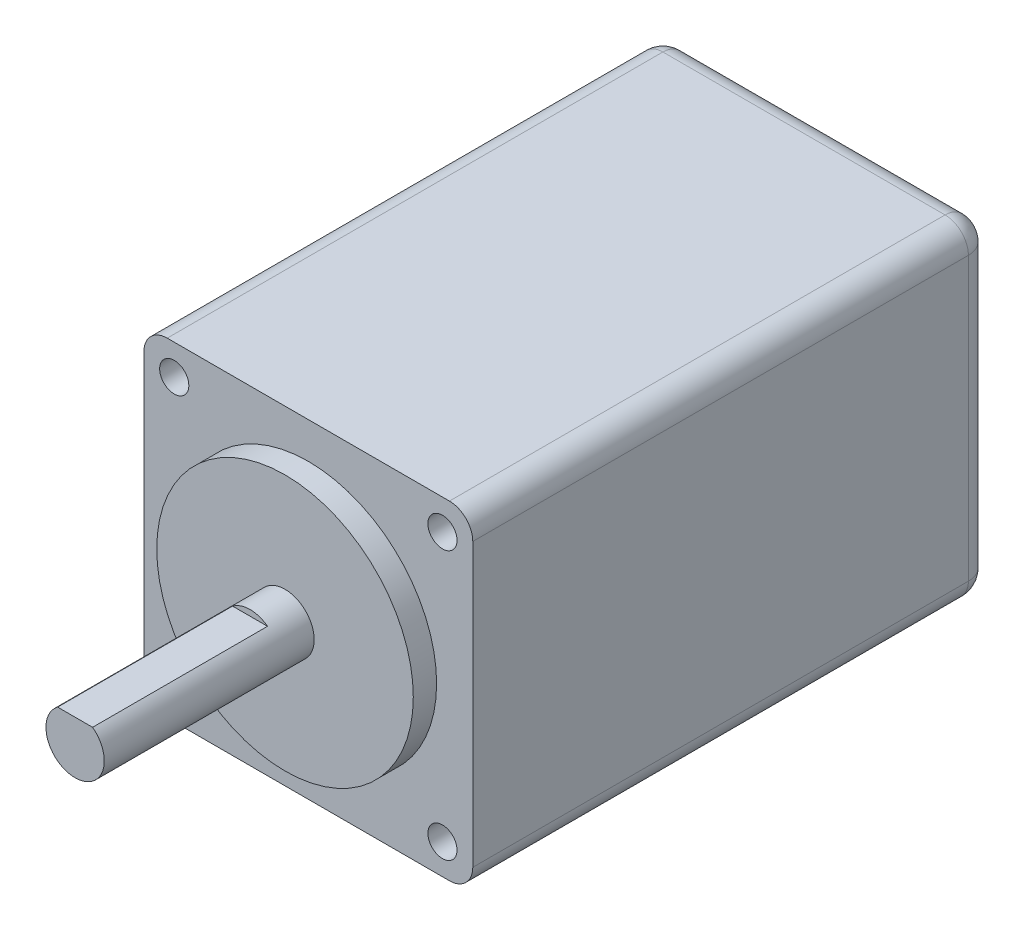
ISO-10303-21;
HEADER;
FILE_DESCRIPTION(('STEP AP214'),'2;1');
FILE_NAME('part.step','',(''),(''),'','','');
FILE_SCHEMA(('AUTOMOTIVE_DESIGN { 1 0 10303 214 1 1 1 1 }'));
ENDSEC;
DATA;
#1=APPLICATION_CONTEXT('core data for automotive mechanical design processes');
#2=APPLICATION_PROTOCOL_DEFINITION('international standard','automotive_design',2000,#1);
#3=PRODUCT_CONTEXT('',#1,'mechanical');
#4=PRODUCT('Part','Part','',(#3));
#5=PRODUCT_RELATED_PRODUCT_CATEGORY('part','',(#4));
#6=PRODUCT_DEFINITION_FORMATION('','',#4);
#7=PRODUCT_DEFINITION_CONTEXT('part definition',#1,'design');
#8=PRODUCT_DEFINITION('design','',#6,#7);
#9=PRODUCT_DEFINITION_SHAPE('','',#8);
#10=(LENGTH_UNIT() NAMED_UNIT(*) SI_UNIT(.MILLI.,.METRE.));
#11=(NAMED_UNIT(*) PLANE_ANGLE_UNIT() SI_UNIT($,.RADIAN.));
#12=(NAMED_UNIT(*) SI_UNIT($,.STERADIAN.) SOLID_ANGLE_UNIT());
#13=UNCERTAINTY_MEASURE_WITH_UNIT(LENGTH_MEASURE(1.E-05),#10,'distance_accuracy_value','');
#14=(GEOMETRIC_REPRESENTATION_CONTEXT(3) GLOBAL_UNCERTAINTY_ASSIGNED_CONTEXT((#13)) GLOBAL_UNIT_ASSIGNED_CONTEXT((#10,
#11,#12)) REPRESENTATION_CONTEXT('',''));
#15=CARTESIAN_POINT('',(0.,0.,0.));
#16=DIRECTION('',(0.,0.,1.));
#17=DIRECTION('',(1.,0.,0.));
#18=AXIS2_PLACEMENT_3D('',#15,#16,#17);
#19=CARTESIAN_POINT('',(0.,0.,46.5));
#20=DIRECTION('',(0.,0.,1.));
#21=DIRECTION('',(1.,0.,0.));
#22=AXIS2_PLACEMENT_3D('',#19,#20,#21);
#23=PLANE('',#22);
#24=CARTESIAN_POINT('',(0.,0.,46.5));
#25=DIRECTION('',(0.,0.,1.));
#26=DIRECTION('',(1.,0.,0.));
#27=AXIS2_PLACEMENT_3D('',#24,#25,#26);
#28=CIRCLE('',#27,11.);
#29=CARTESIAN_POINT('',(11.,0.,46.5));
#30=VERTEX_POINT('',#29);
#31=EDGE_CURVE('E144',#30,#30,#28,.T.);
#32=ORIENTED_EDGE('',*,*,#31,.T.);
#33=EDGE_LOOP('',(#32));
#34=FACE_BOUND('',#33,.T.);
#35=CARTESIAN_POINT('',(0.,0.,46.5));
#36=DIRECTION('',(0.,0.,1.));
#37=DIRECTION('',(1.,0.,0.));
#38=AXIS2_PLACEMENT_3D('',#35,#36,#37);
#39=CIRCLE('',#38,2.5);
#40=CARTESIAN_POINT('',(2.5,0.,46.5));
#41=VERTEX_POINT('',#40);
#42=EDGE_CURVE('E145',#41,#41,#39,.T.);
#43=ORIENTED_EDGE('',*,*,#42,.F.);
#44=EDGE_LOOP('',(#43));
#45=FACE_BOUND('',#44,.T.);
#46=ADVANCED_FACE('F33',(#34,#45),#23,.T.);
#47=CARTESIAN_POINT('',(14.1,14.1,44.5));
#48=DIRECTION('',(0.,0.,-1.));
#49=DIRECTION('',(-1.,0.,0.));
#50=AXIS2_PLACEMENT_3D('',#47,#48,#49);
#51=PLANE('',#50);
#52=CARTESIAN_POINT('',(-11.4999999999997,-11.5,44.5));
#53=DIRECTION('',(0.,0.,1.));
#54=DIRECTION('',(1.,0.,0.));
#55=AXIS2_PLACEMENT_3D('',#52,#53,#54);
#56=CIRCLE('',#55,1.25000000000024);
#57=CARTESIAN_POINT('',(-10.2499999999994,-11.5,44.5));
#58=VERTEX_POINT('',#57);
#59=EDGE_CURVE('E237',#58,#58,#56,.T.);
#60=ORIENTED_EDGE('',*,*,#59,.F.);
#61=EDGE_LOOP('',(#60));
#62=FACE_BOUND('',#61,.T.);
#63=CARTESIAN_POINT('',(11.5000000000003,-11.4999999999997,44.5));
#64=DIRECTION('',(0.,0.,1.));
#65=DIRECTION('',(1.,0.,0.));
#66=AXIS2_PLACEMENT_3D('',#63,#64,#65);
#67=CIRCLE('',#66,1.25000000000049);
#68=CARTESIAN_POINT('',(12.7500000000008,-11.4999999999997,44.5));
#69=VERTEX_POINT('',#68);
#70=EDGE_CURVE('E245',#69,#69,#67,.T.);
#71=ORIENTED_EDGE('',*,*,#70,.F.);
#72=EDGE_LOOP('',(#71));
#73=FACE_BOUND('',#72,.T.);
#74=CARTESIAN_POINT('',(11.5,11.5000000000003,44.5));
#75=DIRECTION('',(0.,0.,1.));
#76=DIRECTION('',(1.,0.,0.));
#77=AXIS2_PLACEMENT_3D('',#74,#75,#76);
#78=CIRCLE('',#77,1.25000000000035);
#79=CARTESIAN_POINT('',(12.7500000000003,11.5000000000003,44.5));
#80=VERTEX_POINT('',#79);
#81=EDGE_CURVE('E251',#80,#80,#78,.T.);
#82=ORIENTED_EDGE('',*,*,#81,.F.);
#83=EDGE_LOOP('',(#82));
#84=FACE_BOUND('',#83,.T.);
#85=CARTESIAN_POINT('',(-11.5,11.5,44.5));
#86=DIRECTION('',(0.,0.,1.));
#87=DIRECTION('',(1.,0.,0.));
#88=AXIS2_PLACEMENT_3D('',#85,#86,#87);
#89=CIRCLE('',#88,1.25);
#90=CARTESIAN_POINT('',(-10.25,11.5,44.5));
#91=VERTEX_POINT('',#90);
#92=EDGE_CURVE('E257',#91,#91,#89,.T.);
#93=ORIENTED_EDGE('',*,*,#92,.F.);
#94=EDGE_LOOP('',(#93));
#95=FACE_BOUND('',#94,.T.);
#96=DIRECTION('',(0.,-1.,0.));
#97=VECTOR('',#96,1.);
#98=CARTESIAN_POINT('',(-14.1,-14.1,44.5));
#99=LINE('',#98,#97);
#100=CARTESIAN_POINT('',(-14.1,12.1,44.5));
#101=VERTEX_POINT('',#100);
#102=CARTESIAN_POINT('',(-14.1,-12.1,44.5));
#103=VERTEX_POINT('',#102);
#104=EDGE_CURVE('E159',#101,#103,#99,.T.);
#105=ORIENTED_EDGE('',*,*,#104,.T.);
#106=CARTESIAN_POINT('',(-12.1,-12.1,44.5));
#107=DIRECTION('',(0.,0.,-1.));
#108=DIRECTION('',(-1.,0.,0.));
#109=AXIS2_PLACEMENT_3D('',#106,#107,#108);
#110=CIRCLE('',#109,2.);
#111=CARTESIAN_POINT('',(-12.1,-14.1,44.5));
#112=VERTEX_POINT('',#111);
#113=EDGE_CURVE('E11',#103,#112,#110,.F.);
#114=ORIENTED_EDGE('',*,*,#113,.T.);
#115=DIRECTION('',(1.,0.,0.));
#116=VECTOR('',#115,1.);
#117=CARTESIAN_POINT('',(-14.1,-14.1,44.5));
#118=LINE('',#117,#116);
#119=CARTESIAN_POINT('',(12.1,-14.1,44.5));
#120=VERTEX_POINT('',#119);
#121=EDGE_CURVE('E162',#112,#120,#118,.T.);
#122=ORIENTED_EDGE('',*,*,#121,.T.);
#123=CARTESIAN_POINT('',(12.1,-12.1,44.5));
#124=DIRECTION('',(0.,0.,-1.));
#125=DIRECTION('',(-1.,0.,0.));
#126=AXIS2_PLACEMENT_3D('',#123,#124,#125);
#127=CIRCLE('',#126,2.);
#128=CARTESIAN_POINT('',(14.1,-12.1,44.5));
#129=VERTEX_POINT('',#128);
#130=EDGE_CURVE('E42',#120,#129,#127,.F.);
#131=ORIENTED_EDGE('',*,*,#130,.T.);
#132=DIRECTION('',(0.,1.,0.));
#133=VECTOR('',#132,1.);
#134=CARTESIAN_POINT('',(14.1,-14.1,44.5));
#135=LINE('',#134,#133);
#136=CARTESIAN_POINT('',(14.1,12.1,44.5));
#137=VERTEX_POINT('',#136);
#138=EDGE_CURVE('E148',#129,#137,#135,.T.);
#139=ORIENTED_EDGE('',*,*,#138,.T.);
#140=CARTESIAN_POINT('',(12.1,12.1,44.5));
#141=DIRECTION('',(0.,0.,-1.));
#142=DIRECTION('',(-1.,0.,0.));
#143=AXIS2_PLACEMENT_3D('',#140,#141,#142);
#144=CIRCLE('',#143,2.);
#145=CARTESIAN_POINT('',(12.1,14.1,44.5));
#146=VERTEX_POINT('',#145);
#147=EDGE_CURVE('E200',#137,#146,#144,.F.);
#148=ORIENTED_EDGE('',*,*,#147,.T.);
#149=DIRECTION('',(-1.,0.,0.));
#150=VECTOR('',#149,1.);
#151=CARTESIAN_POINT('',(-14.1,14.1,44.5));
#152=LINE('',#151,#150);
#153=CARTESIAN_POINT('',(-12.1,14.1,44.5));
#154=VERTEX_POINT('',#153);
#155=EDGE_CURVE('E156',#146,#154,#152,.T.);
#156=ORIENTED_EDGE('',*,*,#155,.T.);
#157=CARTESIAN_POINT('',(-12.1,12.1,44.5));
#158=DIRECTION('',(0.,0.,-1.));
#159=DIRECTION('',(-1.,0.,0.));
#160=AXIS2_PLACEMENT_3D('',#157,#158,#159);
#161=CIRCLE('',#160,2.);
#162=EDGE_CURVE('E202',#154,#101,#161,.F.);
#163=ORIENTED_EDGE('',*,*,#162,.T.);
#164=EDGE_LOOP('',(#105,#114,#122,#131,#139,#148,#156,#163));
#165=FACE_BOUND('',#164,.T.);
#166=CARTESIAN_POINT('',(0.,0.,44.5));
#167=DIRECTION('',(0.,0.,-1.));
#168=DIRECTION('',(-1.,0.,0.));
#169=AXIS2_PLACEMENT_3D('',#166,#167,#168);
#170=CIRCLE('',#169,11.);
#171=CARTESIAN_POINT('',(-11.,0.,44.5));
#172=VERTEX_POINT('',#171);
#173=EDGE_CURVE('E134',#172,#172,#170,.F.);
#174=ORIENTED_EDGE('',*,*,#173,.F.);
#175=EDGE_LOOP('',(#174));
#176=FACE_BOUND('',#175,.T.);
#177=ADVANCED_FACE('F278',(#62,#73,#84,#95,#165,#176),#51,.F.);
#178=CARTESIAN_POINT('',(14.1,-14.1,44.5));
#179=DIRECTION('',(-1.,0.,0.));
#180=DIRECTION('',(0.,0.,1.));
#181=AXIS2_PLACEMENT_3D('',#178,#179,#180);
#182=PLANE('',#181);
#183=ORIENTED_EDGE('',*,*,#138,.F.);
#184=DIRECTION('',(0.,0.,-1.));
#185=VECTOR('',#184,1.);
#186=CARTESIAN_POINT('',(14.1,-12.1,44.5));
#187=LINE('',#186,#185);
#188=CARTESIAN_POINT('',(14.1,-12.1,2.));
#189=VERTEX_POINT('',#188);
#190=EDGE_CURVE('E50',#129,#189,#187,.T.);
#191=ORIENTED_EDGE('',*,*,#190,.T.);
#192=DIRECTION('',(0.,1.,0.));
#193=VECTOR('',#192,1.);
#194=CARTESIAN_POINT('',(14.1,14.1,2.));
#195=LINE('',#194,#193);
#196=CARTESIAN_POINT('',(14.1,12.1,2.));
#197=VERTEX_POINT('',#196);
#198=EDGE_CURVE('E55',#189,#197,#195,.T.);
#199=ORIENTED_EDGE('',*,*,#198,.T.);
#200=DIRECTION('',(0.,0.,-1.));
#201=VECTOR('',#200,1.);
#202=CARTESIAN_POINT('',(14.1,12.1,44.5));
#203=LINE('',#202,#201);
#204=EDGE_CURVE('E196',#197,#137,#203,.F.);
#205=ORIENTED_EDGE('',*,*,#204,.T.);
#206=EDGE_LOOP('',(#183,#191,#199,#205));
#207=FACE_BOUND('',#206,.T.);
#208=ADVANCED_FACE('F284',(#207),#182,.F.);
#209=CARTESIAN_POINT('',(-14.1,14.1,44.5));
#210=DIRECTION('',(0.,-1.,0.));
#211=DIRECTION('',(0.,0.,-1.));
#212=AXIS2_PLACEMENT_3D('',#209,#210,#211);
#213=PLANE('',#212);
#214=DIRECTION('',(-1.,0.,0.));
#215=VECTOR('',#214,1.);
#216=CARTESIAN_POINT('',(-14.1,14.1,2.));
#217=LINE('',#216,#215);
#218=CARTESIAN_POINT('',(12.1,14.1,2.));
#219=VERTEX_POINT('',#218);
#220=CARTESIAN_POINT('',(-12.1,14.1,2.));
#221=VERTEX_POINT('',#220);
#222=EDGE_CURVE('E170',#219,#221,#217,.T.);
#223=ORIENTED_EDGE('',*,*,#222,.T.);
#224=DIRECTION('',(0.,0.,-1.));
#225=VECTOR('',#224,1.);
#226=CARTESIAN_POINT('',(-12.1,14.1,44.5));
#227=LINE('',#226,#225);
#228=EDGE_CURVE('E173',#221,#154,#227,.F.);
#229=ORIENTED_EDGE('',*,*,#228,.T.);
#230=ORIENTED_EDGE('',*,*,#155,.F.);
#231=DIRECTION('',(0.,0.,-1.));
#232=VECTOR('',#231,1.);
#233=CARTESIAN_POINT('',(12.1,14.1,44.5));
#234=LINE('',#233,#232);
#235=EDGE_CURVE('E168',#146,#219,#234,.T.);
#236=ORIENTED_EDGE('',*,*,#235,.T.);
#237=EDGE_LOOP('',(#223,#229,#230,#236));
#238=FACE_BOUND('',#237,.T.);
#239=ADVANCED_FACE('F305',(#238),#213,.F.);
#240=CARTESIAN_POINT('',(-14.1,-14.1,44.5));
#241=DIRECTION('',(1.,0.,0.));
#242=DIRECTION('',(0.,0.,-1.));
#243=AXIS2_PLACEMENT_3D('',#240,#241,#242);
#244=PLANE('',#243);
#245=DIRECTION('',(0.,-1.,0.));
#246=VECTOR('',#245,1.);
#247=CARTESIAN_POINT('',(-14.1,-14.1,2.));
#248=LINE('',#247,#246);
#249=CARTESIAN_POINT('',(-14.1,12.1,2.));
#250=VERTEX_POINT('',#249);
#251=CARTESIAN_POINT('',(-14.1,-12.1,2.));
#252=VERTEX_POINT('',#251);
#253=EDGE_CURVE('E186',#250,#252,#248,.T.);
#254=ORIENTED_EDGE('',*,*,#253,.T.);
#255=DIRECTION('',(0.,0.,-1.));
#256=VECTOR('',#255,1.);
#257=CARTESIAN_POINT('',(-14.1,-12.1,44.5));
#258=LINE('',#257,#256);
#259=EDGE_CURVE('E188',#252,#103,#258,.F.);
#260=ORIENTED_EDGE('',*,*,#259,.T.);
#261=ORIENTED_EDGE('',*,*,#104,.F.);
#262=DIRECTION('',(0.,0.,-1.));
#263=VECTOR('',#262,1.);
#264=CARTESIAN_POINT('',(-14.1,12.1,44.5));
#265=LINE('',#264,#263);
#266=EDGE_CURVE('E184',#101,#250,#265,.T.);
#267=ORIENTED_EDGE('',*,*,#266,.T.);
#268=EDGE_LOOP('',(#254,#260,#261,#267));
#269=FACE_BOUND('',#268,.T.);
#270=ADVANCED_FACE('F301',(#269),#244,.F.);
#271=CARTESIAN_POINT('',(-14.1,-14.1,44.5));
#272=DIRECTION('',(0.,1.,0.));
#273=DIRECTION('',(0.,0.,1.));
#274=AXIS2_PLACEMENT_3D('',#271,#272,#273);
#275=PLANE('',#274);
#276=ORIENTED_EDGE('',*,*,#121,.F.);
#277=DIRECTION('',(0.,0.,-1.));
#278=VECTOR('',#277,1.);
#279=CARTESIAN_POINT('',(-12.1,-14.1,44.5));
#280=LINE('',#279,#278);
#281=CARTESIAN_POINT('',(-12.1,-14.1,2.));
#282=VERTEX_POINT('',#281);
#283=EDGE_CURVE('E194',#112,#282,#280,.T.);
#284=ORIENTED_EDGE('',*,*,#283,.T.);
#285=DIRECTION('',(1.,0.,0.));
#286=VECTOR('',#285,1.);
#287=CARTESIAN_POINT('',(14.1,-14.1,2.));
#288=LINE('',#287,#286);
#289=CARTESIAN_POINT('',(12.1,-14.1,2.));
#290=VERTEX_POINT('',#289);
#291=EDGE_CURVE('E192',#282,#290,#288,.T.);
#292=ORIENTED_EDGE('',*,*,#291,.T.);
#293=DIRECTION('',(0.,0.,-1.));
#294=VECTOR('',#293,1.);
#295=CARTESIAN_POINT('',(12.1,-14.1,44.5));
#296=LINE('',#295,#294);
#297=EDGE_CURVE('E190',#290,#120,#296,.F.);
#298=ORIENTED_EDGE('',*,*,#297,.T.);
#299=EDGE_LOOP('',(#276,#284,#292,#298));
#300=FACE_BOUND('',#299,.T.);
#301=ADVANCED_FACE('F297',(#300),#275,.F.);
#302=CARTESIAN_POINT('',(14.1,14.1,0.));
#303=DIRECTION('',(0.,0.,-1.));
#304=DIRECTION('',(-1.,0.,0.));
#305=AXIS2_PLACEMENT_3D('',#302,#303,#304);
#306=PLANE('',#305);
#307=DIRECTION('',(0.,-1.,0.));
#308=VECTOR('',#307,1.);
#309=CARTESIAN_POINT('',(-12.1,14.1,0.));
#310=LINE('',#309,#308);
#311=CARTESIAN_POINT('',(-12.1,-12.1,0.));
#312=VERTEX_POINT('',#311);
#313=CARTESIAN_POINT('',(-12.1,12.1,0.));
#314=VERTEX_POINT('',#313);
#315=EDGE_CURVE('E179',#312,#314,#310,.F.);
#316=ORIENTED_EDGE('',*,*,#315,.T.);
#317=DIRECTION('',(-1.,0.,0.));
#318=VECTOR('',#317,1.);
#319=CARTESIAN_POINT('',(14.1,12.1,0.));
#320=LINE('',#319,#318);
#321=CARTESIAN_POINT('',(12.1,12.1,0.));
#322=VERTEX_POINT('',#321);
#323=EDGE_CURVE('E181',#314,#322,#320,.F.);
#324=ORIENTED_EDGE('',*,*,#323,.T.);
#325=DIRECTION('',(0.,1.,0.));
#326=VECTOR('',#325,1.);
#327=CARTESIAN_POINT('',(12.1,-14.1,0.));
#328=LINE('',#327,#326);
#329=CARTESIAN_POINT('',(12.1,-12.1,0.));
#330=VERTEX_POINT('',#329);
#331=EDGE_CURVE('E175',#322,#330,#328,.F.);
#332=ORIENTED_EDGE('',*,*,#331,.T.);
#333=DIRECTION('',(1.,0.,0.));
#334=VECTOR('',#333,1.);
#335=CARTESIAN_POINT('',(-14.1,-12.1,0.));
#336=LINE('',#335,#334);
#337=EDGE_CURVE('E177',#330,#312,#336,.F.);
#338=ORIENTED_EDGE('',*,*,#337,.T.);
#339=EDGE_LOOP('',(#316,#324,#332,#338));
#340=FACE_BOUND('',#339,.T.);
#341=ADVANCED_FACE('F292',(#340),#306,.T.);
#342=CARTESIAN_POINT('',(0.,0.,46.5));
#343=DIRECTION('',(0.,0.,-1.));
#344=DIRECTION('',(-1.,0.,0.));
#345=AXIS2_PLACEMENT_3D('',#342,#343,#344);
#346=CYLINDRICAL_SURFACE('',#345,11.);
#347=ORIENTED_EDGE('',*,*,#31,.F.);
#348=EDGE_LOOP('',(#347));
#349=FACE_BOUND('',#348,.T.);
#350=ORIENTED_EDGE('',*,*,#173,.T.);
#351=EDGE_LOOP('',(#350));
#352=FACE_BOUND('',#351,.T.);
#353=ADVANCED_FACE('F290',(#349,#352),#346,.T.);
#354=CARTESIAN_POINT('',(0.,0.,64.5));
#355=DIRECTION('',(0.,0.,-1.));
#356=DIRECTION('',(-1.,0.,0.));
#357=AXIS2_PLACEMENT_3D('',#354,#355,#356);
#358=CYLINDRICAL_SURFACE('',#357,2.5);
#359=CARTESIAN_POINT('',(0.,0.,64.5));
#360=DIRECTION('',(0.,0.,1.));
#361=DIRECTION('',(1.,0.,0.));
#362=AXIS2_PLACEMENT_3D('',#359,#360,#361);
#363=CIRCLE('',#362,2.5);
#364=CARTESIAN_POINT('',(-1.5,2.,64.5));
#365=VERTEX_POINT('',#364);
#366=CARTESIAN_POINT('',(1.5,2.,64.5));
#367=VERTEX_POINT('',#366);
#368=EDGE_CURVE('E140',#365,#367,#363,.T.);
#369=ORIENTED_EDGE('',*,*,#368,.F.);
#370=DIRECTION('',(0.,0.,-1.));
#371=VECTOR('',#370,1.);
#372=CARTESIAN_POINT('',(-1.5,2.,64.5));
#373=LINE('',#372,#371);
#374=CARTESIAN_POINT('',(-1.5,2.,49.5));
#375=VERTEX_POINT('',#374);
#376=EDGE_CURVE('E129',#365,#375,#373,.T.);
#377=ORIENTED_EDGE('',*,*,#376,.T.);
#378=CARTESIAN_POINT('',(0.,0.,49.5));
#379=DIRECTION('',(0.,0.,-1.));
#380=DIRECTION('',(-1.,0.,0.));
#381=AXIS2_PLACEMENT_3D('',#378,#379,#380);
#382=CIRCLE('',#381,2.5);
#383=CARTESIAN_POINT('',(1.5,2.,49.5));
#384=VERTEX_POINT('',#383);
#385=EDGE_CURVE('E133',#375,#384,#382,.T.);
#386=ORIENTED_EDGE('',*,*,#385,.T.);
#387=DIRECTION('',(0.,0.,-1.));
#388=VECTOR('',#387,1.);
#389=CARTESIAN_POINT('',(1.5,2.,64.5));
#390=LINE('',#389,#388);
#391=EDGE_CURVE('E126',#384,#367,#390,.F.);
#392=ORIENTED_EDGE('',*,*,#391,.T.);
#393=EDGE_LOOP('',(#369,#377,#386,#392));
#394=FACE_BOUND('',#393,.T.);
#395=ORIENTED_EDGE('',*,*,#42,.T.);
#396=EDGE_LOOP('',(#395));
#397=FACE_BOUND('',#396,.T.);
#398=ADVANCED_FACE('F138',(#394,#397),#358,.T.);
#399=CARTESIAN_POINT('',(0.,0.,64.5));
#400=DIRECTION('',(0.,0.,1.));
#401=DIRECTION('',(1.,0.,0.));
#402=AXIS2_PLACEMENT_3D('',#399,#400,#401);
#403=PLANE('',#402);
#404=DIRECTION('',(1.,0.,0.));
#405=VECTOR('',#404,1.);
#406=CARTESIAN_POINT('',(0.,2.,64.5));
#407=LINE('',#406,#405);
#408=EDGE_CURVE('E122',#365,#367,#407,.T.);
#409=ORIENTED_EDGE('',*,*,#408,.F.);
#410=ORIENTED_EDGE('',*,*,#368,.T.);
#411=EDGE_LOOP('',(#409,#410));
#412=FACE_BOUND('',#411,.T.);
#413=ADVANCED_FACE('F143',(#412),#403,.T.);
#414=CARTESIAN_POINT('',(-5.,2.5,49.5));
#415=DIRECTION('',(0.,0.,-1.));
#416=DIRECTION('',(-1.,0.,0.));
#417=AXIS2_PLACEMENT_3D('',#414,#415,#416);
#418=PLANE('',#417);
#419=DIRECTION('',(1.,0.,0.));
#420=VECTOR('',#419,1.);
#421=CARTESIAN_POINT('',(-5.,2.,49.5));
#422=LINE('',#421,#420);
#423=EDGE_CURVE('E141',#375,#384,#422,.T.);
#424=ORIENTED_EDGE('',*,*,#423,.T.);
#425=ORIENTED_EDGE('',*,*,#385,.F.);
#426=EDGE_LOOP('',(#424,#425));
#427=FACE_BOUND('',#426,.T.);
#428=ADVANCED_FACE('F266',(#427),#418,.F.);
#429=CARTESIAN_POINT('',(-5.,2.,64.5));
#430=DIRECTION('',(0.,-1.,0.));
#431=DIRECTION('',(0.,0.,-1.));
#432=AXIS2_PLACEMENT_3D('',#429,#430,#431);
#433=PLANE('',#432);
#434=ORIENTED_EDGE('',*,*,#408,.T.);
#435=ORIENTED_EDGE('',*,*,#391,.F.);
#436=ORIENTED_EDGE('',*,*,#423,.F.);
#437=ORIENTED_EDGE('',*,*,#376,.F.);
#438=EDGE_LOOP('',(#434,#435,#436,#437));
#439=FACE_BOUND('',#438,.T.);
#440=ADVANCED_FACE('F124',(#439),#433,.F.);
#441=CARTESIAN_POINT('',(-11.5,11.5,42.));
#442=DIRECTION('',(0.,0.,1.));
#443=DIRECTION('',(1.,0.,0.));
#444=AXIS2_PLACEMENT_3D('',#441,#442,#443);
#445=CYLINDRICAL_SURFACE('',#444,1.25);
#446=CARTESIAN_POINT('',(-11.5,11.5,42.));
#447=DIRECTION('',(0.,0.,1.));
#448=DIRECTION('',(1.,0.,0.));
#449=AXIS2_PLACEMENT_3D('',#446,#447,#448);
#450=CIRCLE('',#449,1.25);
#451=CARTESIAN_POINT('',(-10.25,11.5,42.));
#452=VERTEX_POINT('',#451);
#453=EDGE_CURVE('E260',#452,#452,#450,.T.);
#454=ORIENTED_EDGE('',*,*,#453,.F.);
#455=EDGE_LOOP('',(#454));
#456=FACE_BOUND('',#455,.T.);
#457=ORIENTED_EDGE('',*,*,#92,.T.);
#458=EDGE_LOOP('',(#457));
#459=FACE_BOUND('',#458,.T.);
#460=ADVANCED_FACE('F273',(#456,#459),#445,.F.);
#461=CARTESIAN_POINT('',(-11.5,11.5,42.));
#462=DIRECTION('',(0.,0.,1.));
#463=DIRECTION('',(1.,0.,0.));
#464=AXIS2_PLACEMENT_3D('',#461,#462,#463);
#465=PLANE('',#464);
#466=ORIENTED_EDGE('',*,*,#453,.T.);
#467=EDGE_LOOP('',(#466));
#468=FACE_BOUND('',#467,.T.);
#469=ADVANCED_FACE('F418',(#468),#465,.T.);
#470=CARTESIAN_POINT('',(11.5,11.5000000000003,42.));
#471=DIRECTION('',(0.,0.,1.));
#472=DIRECTION('',(1.,0.,0.));
#473=AXIS2_PLACEMENT_3D('',#470,#471,#472);
#474=CYLINDRICAL_SURFACE('',#473,1.25000000000035);
#475=CARTESIAN_POINT('',(11.5,11.5000000000003,42.));
#476=DIRECTION('',(0.,0.,1.));
#477=DIRECTION('',(1.,0.,0.));
#478=AXIS2_PLACEMENT_3D('',#475,#476,#477);
#479=CIRCLE('',#478,1.25000000000035);
#480=CARTESIAN_POINT('',(12.7500000000003,11.5000000000003,42.));
#481=VERTEX_POINT('',#480);
#482=EDGE_CURVE('E254',#481,#481,#479,.T.);
#483=ORIENTED_EDGE('',*,*,#482,.F.);
#484=EDGE_LOOP('',(#483));
#485=FACE_BOUND('',#484,.T.);
#486=ORIENTED_EDGE('',*,*,#81,.T.);
#487=EDGE_LOOP('',(#486));
#488=FACE_BOUND('',#487,.T.);
#489=ADVANCED_FACE('F414',(#485,#488),#474,.F.);
#490=CARTESIAN_POINT('',(11.5,11.5000000000003,42.));
#491=DIRECTION('',(0.,0.,1.));
#492=DIRECTION('',(1.,0.,0.));
#493=AXIS2_PLACEMENT_3D('',#490,#491,#492);
#494=PLANE('',#493);
#495=ORIENTED_EDGE('',*,*,#482,.T.);
#496=EDGE_LOOP('',(#495));
#497=FACE_BOUND('',#496,.T.);
#498=ADVANCED_FACE('F410',(#497),#494,.T.);
#499=CARTESIAN_POINT('',(11.5000000000003,-11.4999999999997,42.));
#500=DIRECTION('',(0.,0.,1.));
#501=DIRECTION('',(1.,0.,0.));
#502=AXIS2_PLACEMENT_3D('',#499,#500,#501);
#503=CYLINDRICAL_SURFACE('',#502,1.25000000000049);
#504=CARTESIAN_POINT('',(11.5000000000003,-11.4999999999997,42.));
#505=DIRECTION('',(0.,0.,1.));
#506=DIRECTION('',(1.,0.,0.));
#507=AXIS2_PLACEMENT_3D('',#504,#505,#506);
#508=CIRCLE('',#507,1.25000000000049);
#509=CARTESIAN_POINT('',(12.7500000000008,-11.4999999999997,42.));
#510=VERTEX_POINT('',#509);
#511=EDGE_CURVE('E248',#510,#510,#508,.T.);
#512=ORIENTED_EDGE('',*,*,#511,.F.);
#513=EDGE_LOOP('',(#512));
#514=FACE_BOUND('',#513,.T.);
#515=ORIENTED_EDGE('',*,*,#70,.T.);
#516=EDGE_LOOP('',(#515));
#517=FACE_BOUND('',#516,.T.);
#518=ADVANCED_FACE('F406',(#514,#517),#503,.F.);
#519=CARTESIAN_POINT('',(11.5000000000003,-11.4999999999997,42.));
#520=DIRECTION('',(0.,0.,1.));
#521=DIRECTION('',(1.,0.,0.));
#522=AXIS2_PLACEMENT_3D('',#519,#520,#521);
#523=PLANE('',#522);
#524=ORIENTED_EDGE('',*,*,#511,.T.);
#525=EDGE_LOOP('',(#524));
#526=FACE_BOUND('',#525,.T.);
#527=ADVANCED_FACE('F400',(#526),#523,.T.);
#528=CARTESIAN_POINT('',(-11.4999999999997,-11.5,42.));
#529=DIRECTION('',(0.,0.,1.));
#530=DIRECTION('',(1.,0.,0.));
#531=AXIS2_PLACEMENT_3D('',#528,#529,#530);
#532=CYLINDRICAL_SURFACE('',#531,1.25000000000024);
#533=CARTESIAN_POINT('',(-11.4999999999997,-11.5,42.));
#534=DIRECTION('',(0.,0.,1.));
#535=DIRECTION('',(1.,0.,0.));
#536=AXIS2_PLACEMENT_3D('',#533,#534,#535);
#537=CIRCLE('',#536,1.25000000000024);
#538=CARTESIAN_POINT('',(-10.2499999999994,-11.5,42.));
#539=VERTEX_POINT('',#538);
#540=EDGE_CURVE('E240',#539,#539,#537,.T.);
#541=ORIENTED_EDGE('',*,*,#540,.F.);
#542=EDGE_LOOP('',(#541));
#543=FACE_BOUND('',#542,.T.);
#544=ORIENTED_EDGE('',*,*,#59,.T.);
#545=EDGE_LOOP('',(#544));
#546=FACE_BOUND('',#545,.T.);
#547=ADVANCED_FACE('F394',(#543,#546),#532,.F.);
#548=CARTESIAN_POINT('',(-11.4999999999997,-11.5,42.));
#549=DIRECTION('',(0.,0.,1.));
#550=DIRECTION('',(1.,0.,0.));
#551=AXIS2_PLACEMENT_3D('',#548,#549,#550);
#552=PLANE('',#551);
#553=ORIENTED_EDGE('',*,*,#540,.T.);
#554=EDGE_LOOP('',(#553));
#555=FACE_BOUND('',#554,.T.);
#556=ADVANCED_FACE('F356',(#555),#552,.T.);
#557=CARTESIAN_POINT('',(12.1,-12.1,44.5));
#558=DIRECTION('',(0.,0.,-1.));
#559=DIRECTION('',(-1.,0.,0.));
#560=AXIS2_PLACEMENT_3D('',#557,#558,#559);
#561=CYLINDRICAL_SURFACE('',#560,2.);
#562=ORIENTED_EDGE('',*,*,#130,.F.);
#563=ORIENTED_EDGE('',*,*,#297,.F.);
#564=CARTESIAN_POINT('',(12.1,-12.1,2.));
#565=DIRECTION('',(0.,0.,-1.));
#566=DIRECTION('',(-1.,0.,0.));
#567=AXIS2_PLACEMENT_3D('',#564,#565,#566);
#568=CIRCLE('',#567,2.);
#569=EDGE_CURVE('E232',#189,#290,#568,.T.);
#570=ORIENTED_EDGE('',*,*,#569,.F.);
#571=ORIENTED_EDGE('',*,*,#190,.F.);
#572=EDGE_LOOP('',(#562,#563,#570,#571));
#573=FACE_BOUND('',#572,.T.);
#574=ADVANCED_FACE('F35',(#573),#561,.T.);
#575=CARTESIAN_POINT('',(-12.1,-12.1,44.5));
#576=DIRECTION('',(0.,0.,-1.));
#577=DIRECTION('',(-1.,0.,0.));
#578=AXIS2_PLACEMENT_3D('',#575,#576,#577);
#579=CYLINDRICAL_SURFACE('',#578,2.);
#580=ORIENTED_EDGE('',*,*,#113,.F.);
#581=ORIENTED_EDGE('',*,*,#259,.F.);
#582=CARTESIAN_POINT('',(-12.1,-12.1,2.));
#583=DIRECTION('',(0.,0.,-1.));
#584=DIRECTION('',(-1.,0.,0.));
#585=AXIS2_PLACEMENT_3D('',#582,#583,#584);
#586=CIRCLE('',#585,2.);
#587=EDGE_CURVE('E230',#282,#252,#586,.T.);
#588=ORIENTED_EDGE('',*,*,#587,.F.);
#589=ORIENTED_EDGE('',*,*,#283,.F.);
#590=EDGE_LOOP('',(#580,#581,#588,#589));
#591=FACE_BOUND('',#590,.T.);
#592=ADVANCED_FACE('F349',(#591),#579,.T.);
#593=CARTESIAN_POINT('',(-14.1,-12.1,2.));
#594=DIRECTION('',(-1.,0.,0.));
#595=DIRECTION('',(0.,0.,1.));
#596=AXIS2_PLACEMENT_3D('',#593,#594,#595);
#597=CYLINDRICAL_SURFACE('',#596,2.);
#598=CARTESIAN_POINT('',(12.1,-12.1,2.));
#599=DIRECTION('',(1.,0.,0.));
#600=DIRECTION('',(0.,0.,-1.));
#601=AXIS2_PLACEMENT_3D('',#598,#599,#600);
#602=CIRCLE('',#601,2.);
#603=EDGE_CURVE('E37',#290,#330,#602,.T.);
#604=ORIENTED_EDGE('',*,*,#603,.F.);
#605=ORIENTED_EDGE('',*,*,#291,.F.);
#606=CARTESIAN_POINT('',(-12.1,-12.1,2.));
#607=DIRECTION('',(-1.,0.,0.));
#608=DIRECTION('',(0.,0.,1.));
#609=AXIS2_PLACEMENT_3D('',#606,#607,#608);
#610=CIRCLE('',#609,2.);
#611=EDGE_CURVE('E227',#312,#282,#610,.T.);
#612=ORIENTED_EDGE('',*,*,#611,.F.);
#613=ORIENTED_EDGE('',*,*,#337,.F.);
#614=EDGE_LOOP('',(#604,#605,#612,#613));
#615=FACE_BOUND('',#614,.T.);
#616=ADVANCED_FACE('F347',(#615),#597,.T.);
#617=CARTESIAN_POINT('',(12.1,-12.1,2.));
#618=DIRECTION('',(0.,0.,1.));
#619=DIRECTION('',(1.,0.,0.));
#620=AXIS2_PLACEMENT_3D('',#617,#618,#619);
#621=SPHERICAL_SURFACE('',#620,2.);
#622=ORIENTED_EDGE('',*,*,#569,.T.);
#623=ORIENTED_EDGE('',*,*,#603,.T.);
#624=CARTESIAN_POINT('',(12.1,-12.1,2.));
#625=DIRECTION('',(0.,-1.,0.));
#626=DIRECTION('',(0.,0.,-1.));
#627=AXIS2_PLACEMENT_3D('',#624,#625,#626);
#628=CIRCLE('',#627,2.);
#629=EDGE_CURVE('E224',#189,#330,#628,.F.);
#630=ORIENTED_EDGE('',*,*,#629,.F.);
#631=EDGE_LOOP('',(#622,#623,#630));
#632=FACE_BOUND('',#631,.T.);
#633=ADVANCED_FACE('F343',(#632),#621,.T.);
#634=CARTESIAN_POINT('',(-12.1,-12.1,2.));
#635=DIRECTION('',(0.,0.,1.));
#636=DIRECTION('',(1.,0.,0.));
#637=AXIS2_PLACEMENT_3D('',#634,#635,#636);
#638=SPHERICAL_SURFACE('',#637,2.);
#639=ORIENTED_EDGE('',*,*,#611,.T.);
#640=ORIENTED_EDGE('',*,*,#587,.T.);
#641=CARTESIAN_POINT('',(-12.1,-12.1,2.));
#642=DIRECTION('',(0.,-1.,0.));
#643=DIRECTION('',(0.,0.,-1.));
#644=AXIS2_PLACEMENT_3D('',#641,#642,#643);
#645=CIRCLE('',#644,2.);
#646=EDGE_CURVE('E221',#312,#252,#645,.F.);
#647=ORIENTED_EDGE('',*,*,#646,.F.);
#648=EDGE_LOOP('',(#639,#640,#647));
#649=FACE_BOUND('',#648,.T.);
#650=ADVANCED_FACE('F339',(#649),#638,.T.);
#651=CARTESIAN_POINT('',(12.1,-14.1,2.));
#652=DIRECTION('',(0.,-1.,0.));
#653=DIRECTION('',(0.,0.,-1.));
#654=AXIS2_PLACEMENT_3D('',#651,#652,#653);
#655=CYLINDRICAL_SURFACE('',#654,2.);
#656=ORIENTED_EDGE('',*,*,#629,.T.);
#657=ORIENTED_EDGE('',*,*,#331,.F.);
#658=CARTESIAN_POINT('',(12.1,12.1,2.));
#659=DIRECTION('',(0.,1.,0.));
#660=DIRECTION('',(0.,0.,1.));
#661=AXIS2_PLACEMENT_3D('',#658,#659,#660);
#662=CIRCLE('',#661,2.);
#663=EDGE_CURVE('E218',#197,#322,#662,.T.);
#664=ORIENTED_EDGE('',*,*,#663,.F.);
#665=ORIENTED_EDGE('',*,*,#198,.F.);
#666=EDGE_LOOP('',(#656,#657,#664,#665));
#667=FACE_BOUND('',#666,.T.);
#668=ADVANCED_FACE('F335',(#667),#655,.T.);
#669=CARTESIAN_POINT('',(12.1,12.1,44.5));
#670=DIRECTION('',(0.,0.,-1.));
#671=DIRECTION('',(-1.,0.,0.));
#672=AXIS2_PLACEMENT_3D('',#669,#670,#671);
#673=CYLINDRICAL_SURFACE('',#672,2.);
#674=ORIENTED_EDGE('',*,*,#147,.F.);
#675=ORIENTED_EDGE('',*,*,#204,.F.);
#676=CARTESIAN_POINT('',(12.1,12.1,2.));
#677=DIRECTION('',(0.,0.,-1.));
#678=DIRECTION('',(-1.,0.,0.));
#679=AXIS2_PLACEMENT_3D('',#676,#677,#678);
#680=CIRCLE('',#679,2.);
#681=EDGE_CURVE('E215',#219,#197,#680,.T.);
#682=ORIENTED_EDGE('',*,*,#681,.F.);
#683=ORIENTED_EDGE('',*,*,#235,.F.);
#684=EDGE_LOOP('',(#674,#675,#682,#683));
#685=FACE_BOUND('',#684,.T.);
#686=ADVANCED_FACE('F331',(#685),#673,.T.);
#687=CARTESIAN_POINT('',(-12.1,12.1,44.5));
#688=DIRECTION('',(0.,0.,-1.));
#689=DIRECTION('',(-1.,0.,0.));
#690=AXIS2_PLACEMENT_3D('',#687,#688,#689);
#691=CYLINDRICAL_SURFACE('',#690,2.);
#692=ORIENTED_EDGE('',*,*,#162,.F.);
#693=ORIENTED_EDGE('',*,*,#228,.F.);
#694=CARTESIAN_POINT('',(-12.1,12.1,2.));
#695=DIRECTION('',(0.,0.,-1.));
#696=DIRECTION('',(-1.,0.,0.));
#697=AXIS2_PLACEMENT_3D('',#694,#695,#696);
#698=CIRCLE('',#697,2.);
#699=EDGE_CURVE('E212',#250,#221,#698,.T.);
#700=ORIENTED_EDGE('',*,*,#699,.F.);
#701=ORIENTED_EDGE('',*,*,#266,.F.);
#702=EDGE_LOOP('',(#692,#693,#700,#701));
#703=FACE_BOUND('',#702,.T.);
#704=ADVANCED_FACE('F327',(#703),#691,.T.);
#705=CARTESIAN_POINT('',(-12.1,-14.1,2.));
#706=DIRECTION('',(0.,1.,0.));
#707=DIRECTION('',(0.,0.,1.));
#708=AXIS2_PLACEMENT_3D('',#705,#706,#707);
#709=CYLINDRICAL_SURFACE('',#708,2.);
#710=ORIENTED_EDGE('',*,*,#646,.T.);
#711=ORIENTED_EDGE('',*,*,#253,.F.);
#712=CARTESIAN_POINT('',(-12.1,12.1,2.));
#713=DIRECTION('',(0.,1.,0.));
#714=DIRECTION('',(-1.,0.,0.));
#715=AXIS2_PLACEMENT_3D('',#712,#713,#714);
#716=CIRCLE('',#715,2.);
#717=EDGE_CURVE('E209',#314,#250,#716,.T.);
#718=ORIENTED_EDGE('',*,*,#717,.F.);
#719=ORIENTED_EDGE('',*,*,#315,.F.);
#720=EDGE_LOOP('',(#710,#711,#718,#719));
#721=FACE_BOUND('',#720,.T.);
#722=ADVANCED_FACE('F323',(#721),#709,.T.);
#723=CARTESIAN_POINT('',(12.1,12.1,2.));
#724=DIRECTION('',(0.,0.,1.));
#725=DIRECTION('',(1.,0.,0.));
#726=AXIS2_PLACEMENT_3D('',#723,#724,#725);
#727=SPHERICAL_SURFACE('',#726,2.);
#728=ORIENTED_EDGE('',*,*,#681,.T.);
#729=ORIENTED_EDGE('',*,*,#663,.T.);
#730=CARTESIAN_POINT('',(12.1,12.1,2.));
#731=DIRECTION('',(1.,0.,0.));
#732=DIRECTION('',(0.,1.,0.));
#733=AXIS2_PLACEMENT_3D('',#730,#731,#732);
#734=CIRCLE('',#733,2.);
#735=EDGE_CURVE('E207',#219,#322,#734,.F.);
#736=ORIENTED_EDGE('',*,*,#735,.F.);
#737=EDGE_LOOP('',(#728,#729,#736));
#738=FACE_BOUND('',#737,.T.);
#739=ADVANCED_FACE('F319',(#738),#727,.T.);
#740=CARTESIAN_POINT('',(-12.1,12.1,2.));
#741=DIRECTION('',(0.,0.,1.));
#742=DIRECTION('',(1.,0.,0.));
#743=AXIS2_PLACEMENT_3D('',#740,#741,#742);
#744=SPHERICAL_SURFACE('',#743,2.);
#745=ORIENTED_EDGE('',*,*,#717,.T.);
#746=ORIENTED_EDGE('',*,*,#699,.T.);
#747=CARTESIAN_POINT('',(-12.1,12.1,2.));
#748=DIRECTION('',(-1.,0.,0.));
#749=DIRECTION('',(0.,0.,1.));
#750=AXIS2_PLACEMENT_3D('',#747,#748,#749);
#751=CIRCLE('',#750,2.);
#752=EDGE_CURVE('E205',#314,#221,#751,.F.);
#753=ORIENTED_EDGE('',*,*,#752,.F.);
#754=EDGE_LOOP('',(#745,#746,#753));
#755=FACE_BOUND('',#754,.T.);
#756=ADVANCED_FACE('F315',(#755),#744,.T.);
#757=CARTESIAN_POINT('',(-14.1,12.1,2.));
#758=DIRECTION('',(1.,0.,0.));
#759=DIRECTION('',(0.,0.,-1.));
#760=AXIS2_PLACEMENT_3D('',#757,#758,#759);
#761=CYLINDRICAL_SURFACE('',#760,2.);
#762=ORIENTED_EDGE('',*,*,#735,.T.);
#763=ORIENTED_EDGE('',*,*,#323,.F.);
#764=ORIENTED_EDGE('',*,*,#752,.T.);
#765=ORIENTED_EDGE('',*,*,#222,.F.);
#766=EDGE_LOOP('',(#762,#763,#764,#765));
#767=FACE_BOUND('',#766,.T.);
#768=ADVANCED_FACE('F312',(#767),#761,.T.);
#769=CLOSED_SHELL('',(#46,#177,#208,#239,#270,#301,#341,#353,#398,#413,#428,#440,#460,#469,#489,
#498,#518,#527,#547,#556,#574,#592,#616,#633,#650,#668,#686,#704,#722,#739,#756,#768));
#770=MANIFOLD_SOLID_BREP('B2',#769);
#771=ADVANCED_BREP_SHAPE_REPRESENTATION('',(#18,#770),#14);
#772=SHAPE_DEFINITION_REPRESENTATION(#9,#771);
ENDSEC;
END-ISO-10303-21;
